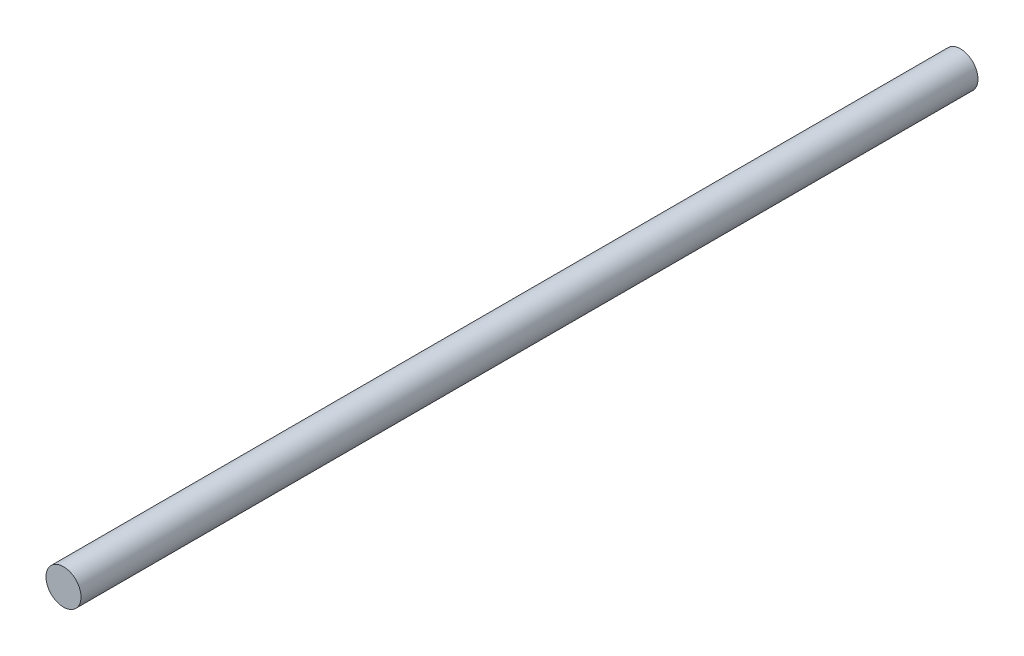
ISO-10303-21;
HEADER;
FILE_DESCRIPTION(('STEP AP214'),'2;1');
FILE_NAME('part.step','',(''),(''),'','','');
FILE_SCHEMA(('AUTOMOTIVE_DESIGN { 1 0 10303 214 1 1 1 1 }'));
ENDSEC;
DATA;
#1=APPLICATION_CONTEXT('core data for automotive mechanical design processes');
#2=APPLICATION_PROTOCOL_DEFINITION('international standard','automotive_design',2000,#1);
#3=PRODUCT_CONTEXT('',#1,'mechanical');
#4=PRODUCT('Part','Part','',(#3));
#5=PRODUCT_RELATED_PRODUCT_CATEGORY('part','',(#4));
#6=PRODUCT_DEFINITION_FORMATION('','',#4);
#7=PRODUCT_DEFINITION_CONTEXT('part definition',#1,'design');
#8=PRODUCT_DEFINITION('design','',#6,#7);
#9=PRODUCT_DEFINITION_SHAPE('','',#8);
#10=(LENGTH_UNIT() NAMED_UNIT(*) SI_UNIT(.MILLI.,.METRE.));
#11=(NAMED_UNIT(*) PLANE_ANGLE_UNIT() SI_UNIT($,.RADIAN.));
#12=(NAMED_UNIT(*) SI_UNIT($,.STERADIAN.) SOLID_ANGLE_UNIT());
#13=UNCERTAINTY_MEASURE_WITH_UNIT(LENGTH_MEASURE(1.E-05),#10,'distance_accuracy_value','');
#14=(GEOMETRIC_REPRESENTATION_CONTEXT(3) GLOBAL_UNCERTAINTY_ASSIGNED_CONTEXT((#13)) GLOBAL_UNIT_ASSIGNED_CONTEXT((#10,
#11,#12)) REPRESENTATION_CONTEXT('',''));
#15=CARTESIAN_POINT('',(0.,0.,0.));
#16=DIRECTION('',(0.,0.,1.));
#17=DIRECTION('',(1.,0.,0.));
#18=AXIS2_PLACEMENT_3D('',#15,#16,#17);
#19=CARTESIAN_POINT('',(0.,0.,650.));
#20=DIRECTION('',(0.,0.,-1.));
#21=DIRECTION('',(-1.,0.,0.));
#22=AXIS2_PLACEMENT_3D('',#19,#20,#21);
#23=CYLINDRICAL_SURFACE('',#22,12.7);
#24=CARTESIAN_POINT('',(0.,0.,650.));
#25=DIRECTION('',(0.,0.,1.));
#26=DIRECTION('',(1.,0.,0.));
#27=AXIS2_PLACEMENT_3D('',#24,#25,#26);
#28=CIRCLE('',#27,12.7);
#29=CARTESIAN_POINT('',(12.7,0.,650.));
#30=VERTEX_POINT('',#29);
#31=EDGE_CURVE('E10',#30,#30,#28,.T.);
#32=ORIENTED_EDGE('',*,*,#31,.F.);
#33=EDGE_LOOP('',(#32));
#34=FACE_BOUND('',#33,.T.);
#35=CARTESIAN_POINT('',(0.,0.,0.));
#36=DIRECTION('',(0.,0.,1.));
#37=DIRECTION('',(1.,0.,0.));
#38=AXIS2_PLACEMENT_3D('',#35,#36,#37);
#39=CIRCLE('',#38,12.7);
#40=CARTESIAN_POINT('',(12.7,0.,0.));
#41=VERTEX_POINT('',#40);
#42=EDGE_CURVE('E38',#41,#41,#39,.T.);
#43=ORIENTED_EDGE('',*,*,#42,.T.);
#44=EDGE_LOOP('',(#43));
#45=FACE_BOUND('',#44,.T.);
#46=ADVANCED_FACE('F35',(#34,#45),#23,.T.);
#47=CARTESIAN_POINT('',(0.,0.,650.));
#48=DIRECTION('',(0.,0.,1.));
#49=DIRECTION('',(1.,0.,0.));
#50=AXIS2_PLACEMENT_3D('',#47,#48,#49);
#51=PLANE('',#50);
#52=ORIENTED_EDGE('',*,*,#31,.T.);
#53=EDGE_LOOP('',(#52));
#54=FACE_BOUND('',#53,.T.);
#55=ADVANCED_FACE('F50',(#54),#51,.T.);
#56=CARTESIAN_POINT('',(0.,0.,0.));
#57=DIRECTION('',(0.,0.,1.));
#58=DIRECTION('',(1.,0.,0.));
#59=AXIS2_PLACEMENT_3D('',#56,#57,#58);
#60=PLANE('',#59);
#61=ORIENTED_EDGE('',*,*,#42,.F.);
#62=EDGE_LOOP('',(#61));
#63=FACE_BOUND('',#62,.T.);
#64=ADVANCED_FACE('F48',(#63),#60,.F.);
#65=CLOSED_SHELL('',(#46,#55,#64));
#66=MANIFOLD_SOLID_BREP('B2',#65);
#67=ADVANCED_BREP_SHAPE_REPRESENTATION('',(#18,#66),#14);
#68=SHAPE_DEFINITION_REPRESENTATION(#9,#67);
ENDSEC;
END-ISO-10303-21;
